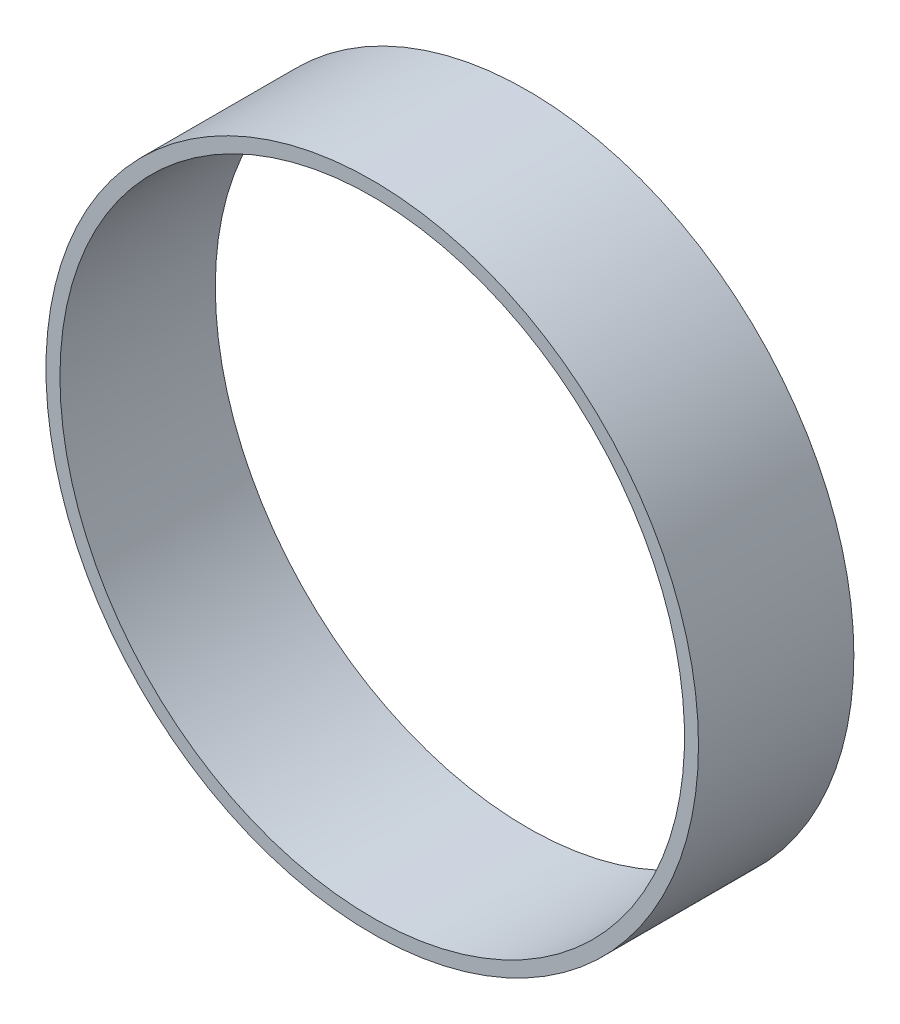
ISO-10303-21;
HEADER;
FILE_DESCRIPTION(('STEP AP214'),'2;1');
FILE_NAME('part.step','',(''),(''),'','','');
FILE_SCHEMA(('AUTOMOTIVE_DESIGN { 1 0 10303 214 1 1 1 1 }'));
ENDSEC;
DATA;
#1=APPLICATION_CONTEXT('core data for automotive mechanical design processes');
#2=APPLICATION_PROTOCOL_DEFINITION('international standard','automotive_design',2000,#1);
#3=PRODUCT_CONTEXT('',#1,'mechanical');
#4=PRODUCT('Part','Part','',(#3));
#5=PRODUCT_RELATED_PRODUCT_CATEGORY('part','',(#4));
#6=PRODUCT_DEFINITION_FORMATION('','',#4);
#7=PRODUCT_DEFINITION_CONTEXT('part definition',#1,'design');
#8=PRODUCT_DEFINITION('design','',#6,#7);
#9=PRODUCT_DEFINITION_SHAPE('','',#8);
#10=(LENGTH_UNIT() NAMED_UNIT(*) SI_UNIT(.MILLI.,.METRE.));
#11=(NAMED_UNIT(*) PLANE_ANGLE_UNIT() SI_UNIT($,.RADIAN.));
#12=(NAMED_UNIT(*) SI_UNIT($,.STERADIAN.) SOLID_ANGLE_UNIT());
#13=UNCERTAINTY_MEASURE_WITH_UNIT(LENGTH_MEASURE(1.E-05),#10,'distance_accuracy_value','');
#14=(GEOMETRIC_REPRESENTATION_CONTEXT(3) GLOBAL_UNCERTAINTY_ASSIGNED_CONTEXT((#13)) GLOBAL_UNIT_ASSIGNED_CONTEXT((#10,
#11,#12)) REPRESENTATION_CONTEXT('',''));
#15=CARTESIAN_POINT('',(0.,0.,0.));
#16=DIRECTION('',(0.,0.,1.));
#17=DIRECTION('',(1.,0.,0.));
#18=AXIS2_PLACEMENT_3D('',#15,#16,#17);
#19=CARTESIAN_POINT('',(0.,0.,5.));
#20=DIRECTION('',(0.,0.,-1.));
#21=DIRECTION('',(-1.,0.,0.));
#22=AXIS2_PLACEMENT_3D('',#19,#20,#21);
#23=CYLINDRICAL_SURFACE('',#22,10.5);
#24=CARTESIAN_POINT('',(0.,0.,5.));
#25=DIRECTION('',(0.,0.,1.));
#26=DIRECTION('',(1.,0.,0.));
#27=AXIS2_PLACEMENT_3D('',#24,#25,#26);
#28=CIRCLE('',#27,10.5);
#29=CARTESIAN_POINT('',(10.5,0.,5.));
#30=VERTEX_POINT('',#29);
#31=EDGE_CURVE('E10',#30,#30,#28,.T.);
#32=ORIENTED_EDGE('',*,*,#31,.F.);
#33=EDGE_LOOP('',(#32));
#34=FACE_BOUND('',#33,.T.);
#35=CARTESIAN_POINT('',(0.,0.,0.));
#36=DIRECTION('',(0.,0.,1.));
#37=DIRECTION('',(1.,0.,0.));
#38=AXIS2_PLACEMENT_3D('',#35,#36,#37);
#39=CIRCLE('',#38,10.5);
#40=CARTESIAN_POINT('',(10.5,0.,0.));
#41=VERTEX_POINT('',#40);
#42=EDGE_CURVE('E36',#41,#41,#39,.T.);
#43=ORIENTED_EDGE('',*,*,#42,.T.);
#44=EDGE_LOOP('',(#43));
#45=FACE_BOUND('',#44,.T.);
#46=ADVANCED_FACE('F33',(#34,#45),#23,.T.);
#47=CARTESIAN_POINT('',(0.,0.,5.));
#48=DIRECTION('',(0.,0.,1.));
#49=DIRECTION('',(1.,0.,0.));
#50=AXIS2_PLACEMENT_3D('',#47,#48,#49);
#51=PLANE('',#50);
#52=CARTESIAN_POINT('',(0.,0.,5.));
#53=DIRECTION('',(0.,0.,-1.));
#54=DIRECTION('',(-1.,0.,0.));
#55=AXIS2_PLACEMENT_3D('',#52,#53,#54);
#56=CIRCLE('',#55,10.05);
#57=CARTESIAN_POINT('',(-10.05,0.,5.));
#58=VERTEX_POINT('',#57);
#59=EDGE_CURVE('E43',#58,#58,#56,.T.);
#60=ORIENTED_EDGE('',*,*,#59,.T.);
#61=EDGE_LOOP('',(#60));
#62=FACE_BOUND('',#61,.T.);
#63=ORIENTED_EDGE('',*,*,#31,.T.);
#64=EDGE_LOOP('',(#63));
#65=FACE_BOUND('',#64,.T.);
#66=ADVANCED_FACE('F51',(#62,#65),#51,.T.);
#67=CARTESIAN_POINT('',(0.,0.,0.));
#68=DIRECTION('',(0.,0.,1.));
#69=DIRECTION('',(1.,0.,0.));
#70=AXIS2_PLACEMENT_3D('',#67,#68,#69);
#71=PLANE('',#70);
#72=CARTESIAN_POINT('',(0.,0.,0.));
#73=DIRECTION('',(0.,0.,-1.));
#74=DIRECTION('',(-1.,0.,0.));
#75=AXIS2_PLACEMENT_3D('',#72,#73,#74);
#76=CIRCLE('',#75,10.05);
#77=CARTESIAN_POINT('',(-10.05,0.,0.));
#78=VERTEX_POINT('',#77);
#79=EDGE_CURVE('E45',#78,#78,#76,.T.);
#80=ORIENTED_EDGE('',*,*,#79,.F.);
#81=EDGE_LOOP('',(#80));
#82=FACE_BOUND('',#81,.T.);
#83=ORIENTED_EDGE('',*,*,#42,.F.);
#84=EDGE_LOOP('',(#83));
#85=FACE_BOUND('',#84,.T.);
#86=ADVANCED_FACE('F56',(#82,#85),#71,.F.);
#87=CARTESIAN_POINT('',(0.,0.,5.));
#88=DIRECTION('',(0.,0.,-1.));
#89=DIRECTION('',(-1.,0.,0.));
#90=AXIS2_PLACEMENT_3D('',#87,#88,#89);
#91=CYLINDRICAL_SURFACE('',#90,10.05);
#92=ORIENTED_EDGE('',*,*,#59,.F.);
#93=EDGE_LOOP('',(#92));
#94=FACE_BOUND('',#93,.T.);
#95=ORIENTED_EDGE('',*,*,#79,.T.);
#96=EDGE_LOOP('',(#95));
#97=FACE_BOUND('',#96,.T.);
#98=ADVANCED_FACE('F53',(#94,#97),#91,.F.);
#99=CLOSED_SHELL('',(#46,#66,#86,#98));
#100=MANIFOLD_SOLID_BREP('B2',#99);
#101=ADVANCED_BREP_SHAPE_REPRESENTATION('',(#18,#100),#14);
#102=SHAPE_DEFINITION_REPRESENTATION(#9,#101);
ENDSEC;
END-ISO-10303-21;
